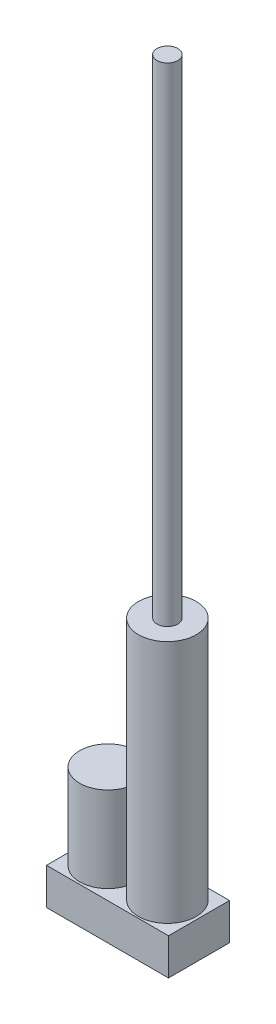
ISO-10303-21;
HEADER;
FILE_DESCRIPTION(('STEP AP214'),'2;1');
FILE_NAME('part.step','',(''),(''),'','','');
FILE_SCHEMA(('AUTOMOTIVE_DESIGN { 1 0 10303 214 1 1 1 1 }'));
ENDSEC;
DATA;
#1=APPLICATION_CONTEXT('core data for automotive mechanical design processes');
#2=APPLICATION_PROTOCOL_DEFINITION('international standard','automotive_design',2000,#1);
#3=PRODUCT_CONTEXT('',#1,'mechanical');
#4=PRODUCT('Part','Part','',(#3));
#5=PRODUCT_RELATED_PRODUCT_CATEGORY('part','',(#4));
#6=PRODUCT_DEFINITION_FORMATION('','',#4);
#7=PRODUCT_DEFINITION_CONTEXT('part definition',#1,'design');
#8=PRODUCT_DEFINITION('design','',#6,#7);
#9=PRODUCT_DEFINITION_SHAPE('','',#8);
#10=(LENGTH_UNIT() NAMED_UNIT(*) SI_UNIT(.MILLI.,.METRE.));
#11=(NAMED_UNIT(*) PLANE_ANGLE_UNIT() SI_UNIT($,.RADIAN.));
#12=(NAMED_UNIT(*) SI_UNIT($,.STERADIAN.) SOLID_ANGLE_UNIT());
#13=UNCERTAINTY_MEASURE_WITH_UNIT(LENGTH_MEASURE(1.E-05),#10,'distance_accuracy_value','');
#14=(GEOMETRIC_REPRESENTATION_CONTEXT(3) GLOBAL_UNCERTAINTY_ASSIGNED_CONTEXT((#13)) GLOBAL_UNIT_ASSIGNED_CONTEXT((#10,
#11,#12)) REPRESENTATION_CONTEXT('',''));
#15=CARTESIAN_POINT('',(0.,0.,0.));
#16=DIRECTION('',(0.,0.,1.));
#17=DIRECTION('',(1.,0.,0.));
#18=AXIS2_PLACEMENT_3D('',#15,#16,#17);
#19=CARTESIAN_POINT('',(-50.,30.,-25.));
#20=DIRECTION('',(0.,0.,-1.));
#21=DIRECTION('',(-1.,0.,0.));
#22=AXIS2_PLACEMENT_3D('',#19,#20,#21);
#23=PLANE('',#22);
#24=DIRECTION('',(1.,0.,0.));
#25=VECTOR('',#24,1.);
#26=CARTESIAN_POINT('',(-50.,0.,-25.));
#27=LINE('',#26,#25);
#28=CARTESIAN_POINT('',(-50.,0.,-25.));
#29=VERTEX_POINT('',#28);
#30=CARTESIAN_POINT('',(50.,0.,-25.));
#31=VERTEX_POINT('',#30);
#32=EDGE_CURVE('E103',#29,#31,#27,.T.);
#33=ORIENTED_EDGE('',*,*,#32,.F.);
#34=DIRECTION('',(0.,-1.,0.));
#35=VECTOR('',#34,1.);
#36=CARTESIAN_POINT('',(-50.,30.,-25.));
#37=LINE('',#36,#35);
#38=CARTESIAN_POINT('',(-50.,30.,-25.));
#39=VERTEX_POINT('',#38);
#40=EDGE_CURVE('E45',#39,#29,#37,.T.);
#41=ORIENTED_EDGE('',*,*,#40,.F.);
#42=DIRECTION('',(1.,0.,0.));
#43=VECTOR('',#42,1.);
#44=CARTESIAN_POINT('',(-50.,30.,-25.));
#45=LINE('',#44,#43);
#46=CARTESIAN_POINT('',(50.,30.,-25.));
#47=VERTEX_POINT('',#46);
#48=EDGE_CURVE('E96',#39,#47,#45,.T.);
#49=ORIENTED_EDGE('',*,*,#48,.T.);
#50=DIRECTION('',(0.,-1.,0.));
#51=VECTOR('',#50,1.);
#52=CARTESIAN_POINT('',(50.,30.,-25.));
#53=LINE('',#52,#51);
#54=EDGE_CURVE('E39',#47,#31,#53,.T.);
#55=ORIENTED_EDGE('',*,*,#54,.T.);
#56=EDGE_LOOP('',(#33,#41,#49,#55));
#57=FACE_BOUND('',#56,.T.);
#58=ADVANCED_FACE('F36',(#57),#23,.T.);
#59=CARTESIAN_POINT('',(-50.,30.,25.));
#60=DIRECTION('',(-1.,0.,0.));
#61=DIRECTION('',(0.,0.,1.));
#62=AXIS2_PLACEMENT_3D('',#59,#60,#61);
#63=PLANE('',#62);
#64=DIRECTION('',(0.,0.,-1.));
#65=VECTOR('',#64,1.);
#66=CARTESIAN_POINT('',(-50.,0.,25.));
#67=LINE('',#66,#65);
#68=CARTESIAN_POINT('',(-50.,0.,25.));
#69=VERTEX_POINT('',#68);
#70=EDGE_CURVE('E98',#69,#29,#67,.T.);
#71=ORIENTED_EDGE('',*,*,#70,.F.);
#72=DIRECTION('',(0.,-1.,0.));
#73=VECTOR('',#72,1.);
#74=CARTESIAN_POINT('',(-50.,30.,25.));
#75=LINE('',#74,#73);
#76=CARTESIAN_POINT('',(-50.,30.,25.));
#77=VERTEX_POINT('',#76);
#78=EDGE_CURVE('E69',#77,#69,#75,.T.);
#79=ORIENTED_EDGE('',*,*,#78,.F.);
#80=DIRECTION('',(0.,0.,-1.));
#81=VECTOR('',#80,1.);
#82=CARTESIAN_POINT('',(-50.,30.,25.));
#83=LINE('',#82,#81);
#84=EDGE_CURVE('E86',#77,#39,#83,.T.);
#85=ORIENTED_EDGE('',*,*,#84,.T.);
#86=ORIENTED_EDGE('',*,*,#40,.T.);
#87=EDGE_LOOP('',(#71,#79,#85,#86));
#88=FACE_BOUND('',#87,.T.);
#89=ADVANCED_FACE('F115',(#88),#63,.T.);
#90=CARTESIAN_POINT('',(-50.,30.,25.));
#91=DIRECTION('',(0.,0.,-1.));
#92=DIRECTION('',(-1.,0.,0.));
#93=AXIS2_PLACEMENT_3D('',#90,#91,#92);
#94=PLANE('',#93);
#95=DIRECTION('',(1.,0.,0.));
#96=VECTOR('',#95,1.);
#97=CARTESIAN_POINT('',(-50.,0.,25.));
#98=LINE('',#97,#96);
#99=CARTESIAN_POINT('',(50.,0.,25.));
#100=VERTEX_POINT('',#99);
#101=EDGE_CURVE('E91',#69,#100,#98,.T.);
#102=ORIENTED_EDGE('',*,*,#101,.T.);
#103=DIRECTION('',(0.,-1.,0.));
#104=VECTOR('',#103,1.);
#105=CARTESIAN_POINT('',(50.,30.,25.));
#106=LINE('',#105,#104);
#107=CARTESIAN_POINT('',(50.,30.,25.));
#108=VERTEX_POINT('',#107);
#109=EDGE_CURVE('E89',#108,#100,#106,.T.);
#110=ORIENTED_EDGE('',*,*,#109,.F.);
#111=DIRECTION('',(1.,0.,0.));
#112=VECTOR('',#111,1.);
#113=CARTESIAN_POINT('',(-50.,30.,25.));
#114=LINE('',#113,#112);
#115=EDGE_CURVE('E83',#77,#108,#114,.T.);
#116=ORIENTED_EDGE('',*,*,#115,.F.);
#117=ORIENTED_EDGE('',*,*,#78,.T.);
#118=EDGE_LOOP('',(#102,#110,#116,#117));
#119=FACE_BOUND('',#118,.T.);
#120=ADVANCED_FACE('F90',(#119),#94,.F.);
#121=CARTESIAN_POINT('',(50.,30.,25.));
#122=DIRECTION('',(-1.,0.,0.));
#123=DIRECTION('',(0.,0.,1.));
#124=AXIS2_PLACEMENT_3D('',#121,#122,#123);
#125=PLANE('',#124);
#126=DIRECTION('',(0.,0.,-1.));
#127=VECTOR('',#126,1.);
#128=CARTESIAN_POINT('',(50.,0.,25.));
#129=LINE('',#128,#127);
#130=EDGE_CURVE('E106',#100,#31,#129,.T.);
#131=ORIENTED_EDGE('',*,*,#130,.T.);
#132=ORIENTED_EDGE('',*,*,#54,.F.);
#133=DIRECTION('',(0.,0.,-1.));
#134=VECTOR('',#133,1.);
#135=CARTESIAN_POINT('',(50.,30.,25.));
#136=LINE('',#135,#134);
#137=EDGE_CURVE('E80',#108,#47,#136,.T.);
#138=ORIENTED_EDGE('',*,*,#137,.F.);
#139=ORIENTED_EDGE('',*,*,#109,.T.);
#140=EDGE_LOOP('',(#131,#132,#138,#139));
#141=FACE_BOUND('',#140,.T.);
#142=ADVANCED_FACE('F95',(#141),#125,.F.);
#143=CARTESIAN_POINT('',(0.,30.,0.));
#144=DIRECTION('',(0.,1.,0.));
#145=DIRECTION('',(0.,0.,1.));
#146=AXIS2_PLACEMENT_3D('',#143,#144,#145);
#147=PLANE('',#146);
#148=CARTESIAN_POINT('',(24.0895230885582,30.,0.));
#149=DIRECTION('',(0.,1.,0.));
#150=DIRECTION('',(0.,0.,1.));
#151=AXIS2_PLACEMENT_3D('',#148,#149,#150);
#152=CIRCLE('',#151,23.6563203313673);
#153=CARTESIAN_POINT('',(24.0895230885582,30.,23.6563203313673));
#154=VERTEX_POINT('',#153);
#155=EDGE_CURVE('E164',#154,#154,#152,.T.);
#156=ORIENTED_EDGE('',*,*,#155,.F.);
#157=EDGE_LOOP('',(#156));
#158=FACE_BOUND('',#157,.T.);
#159=CARTESIAN_POINT('',(-24.6288407696454,30.,0.));
#160=DIRECTION('',(0.,1.,0.));
#161=DIRECTION('',(0.,0.,1.));
#162=AXIS2_PLACEMENT_3D('',#159,#160,#161);
#163=CIRCLE('',#162,23.1627718029796);
#164=CARTESIAN_POINT('',(-24.6288407696454,30.,23.1627718029796));
#165=VERTEX_POINT('',#164);
#166=EDGE_CURVE('E171',#165,#165,#163,.T.);
#167=ORIENTED_EDGE('',*,*,#166,.F.);
#168=EDGE_LOOP('',(#167));
#169=FACE_BOUND('',#168,.T.);
#170=ORIENTED_EDGE('',*,*,#48,.F.);
#171=ORIENTED_EDGE('',*,*,#84,.F.);
#172=ORIENTED_EDGE('',*,*,#115,.T.);
#173=ORIENTED_EDGE('',*,*,#137,.T.);
#174=EDGE_LOOP('',(#170,#171,#172,#173));
#175=FACE_BOUND('',#174,.T.);
#176=ADVANCED_FACE('F85',(#158,#169,#175),#147,.T.);
#177=CARTESIAN_POINT('',(0.,0.,0.));
#178=DIRECTION('',(0.,1.,0.));
#179=DIRECTION('',(0.,0.,1.));
#180=AXIS2_PLACEMENT_3D('',#177,#178,#179);
#181=PLANE('',#180);
#182=ORIENTED_EDGE('',*,*,#32,.T.);
#183=ORIENTED_EDGE('',*,*,#130,.F.);
#184=ORIENTED_EDGE('',*,*,#101,.F.);
#185=ORIENTED_EDGE('',*,*,#70,.T.);
#186=EDGE_LOOP('',(#182,#183,#184,#185));
#187=FACE_BOUND('',#186,.T.);
#188=ADVANCED_FACE('F114',(#187),#181,.F.);
#189=CARTESIAN_POINT('',(-24.6288407696454,100.,0.));
#190=DIRECTION('',(0.,-1.,0.));
#191=DIRECTION('',(0.,0.,-1.));
#192=AXIS2_PLACEMENT_3D('',#189,#190,#191);
#193=CYLINDRICAL_SURFACE('',#192,23.1627718029796);
#194=CARTESIAN_POINT('',(-24.6288407696454,100.,0.));
#195=DIRECTION('',(0.,1.,0.));
#196=DIRECTION('',(0.,0.,1.));
#197=AXIS2_PLACEMENT_3D('',#194,#195,#196);
#198=CIRCLE('',#197,23.1627718029796);
#199=CARTESIAN_POINT('',(-24.6288407696454,100.,23.1627718029796));
#200=VERTEX_POINT('',#199);
#201=EDGE_CURVE('E107',#200,#200,#198,.T.);
#202=ORIENTED_EDGE('',*,*,#201,.F.);
#203=EDGE_LOOP('',(#202));
#204=FACE_BOUND('',#203,.T.);
#205=ORIENTED_EDGE('',*,*,#166,.T.);
#206=EDGE_LOOP('',(#205));
#207=FACE_BOUND('',#206,.T.);
#208=ADVANCED_FACE('F133',(#204,#207),#193,.T.);
#209=CARTESIAN_POINT('',(-24.6288407696454,100.,0.));
#210=DIRECTION('',(0.,1.,0.));
#211=DIRECTION('',(0.,0.,1.));
#212=AXIS2_PLACEMENT_3D('',#209,#210,#211);
#213=PLANE('',#212);
#214=ORIENTED_EDGE('',*,*,#201,.T.);
#215=EDGE_LOOP('',(#214));
#216=FACE_BOUND('',#215,.T.);
#217=ADVANCED_FACE('F139',(#216),#213,.T.);
#218=CARTESIAN_POINT('',(24.0895230885582,230.,0.));
#219=DIRECTION('',(0.,-1.,0.));
#220=DIRECTION('',(0.,0.,-1.));
#221=AXIS2_PLACEMENT_3D('',#218,#219,#220);
#222=CYLINDRICAL_SURFACE('',#221,23.6563203313673);
#223=CARTESIAN_POINT('',(24.0895230885582,230.,0.));
#224=DIRECTION('',(0.,1.,0.));
#225=DIRECTION('',(0.,0.,1.));
#226=AXIS2_PLACEMENT_3D('',#223,#224,#225);
#227=CIRCLE('',#226,23.6563203313673);
#228=CARTESIAN_POINT('',(24.0895230885582,230.,23.6563203313673));
#229=VERTEX_POINT('',#228);
#230=EDGE_CURVE('E167',#229,#229,#227,.T.);
#231=ORIENTED_EDGE('',*,*,#230,.F.);
#232=EDGE_LOOP('',(#231));
#233=FACE_BOUND('',#232,.T.);
#234=ORIENTED_EDGE('',*,*,#155,.T.);
#235=EDGE_LOOP('',(#234));
#236=FACE_BOUND('',#235,.T.);
#237=ADVANCED_FACE('F143',(#233,#236),#222,.T.);
#238=CARTESIAN_POINT('',(24.0895230885582,230.,0.));
#239=DIRECTION('',(0.,1.,0.));
#240=DIRECTION('',(0.,0.,1.));
#241=AXIS2_PLACEMENT_3D('',#238,#239,#240);
#242=PLANE('',#241);
#243=CARTESIAN_POINT('',(24.0895230885582,230.,0.));
#244=DIRECTION('',(0.,1.,0.));
#245=DIRECTION('',(0.,0.,1.));
#246=AXIS2_PLACEMENT_3D('',#243,#244,#245);
#247=CIRCLE('',#246,8.52546609340794);
#248=CARTESIAN_POINT('',(24.0895230885582,230.,8.52546609340794));
#249=VERTEX_POINT('',#248);
#250=EDGE_CURVE('E11',#249,#249,#247,.T.);
#251=ORIENTED_EDGE('',*,*,#250,.F.);
#252=EDGE_LOOP('',(#251));
#253=FACE_BOUND('',#252,.T.);
#254=ORIENTED_EDGE('',*,*,#230,.T.);
#255=EDGE_LOOP('',(#254));
#256=FACE_BOUND('',#255,.T.);
#257=ADVANCED_FACE('F147',(#253,#256),#242,.T.);
#258=CARTESIAN_POINT('',(24.0895230885582,630.,0.));
#259=DIRECTION('',(0.,-1.,0.));
#260=DIRECTION('',(0.,0.,-1.));
#261=AXIS2_PLACEMENT_3D('',#258,#259,#260);
#262=CYLINDRICAL_SURFACE('',#261,8.52546609340794);
#263=CARTESIAN_POINT('',(24.0895230885582,630.,0.));
#264=DIRECTION('',(0.,1.,0.));
#265=DIRECTION('',(0.,0.,1.));
#266=AXIS2_PLACEMENT_3D('',#263,#264,#265);
#267=CIRCLE('',#266,8.52546609340794);
#268=CARTESIAN_POINT('',(24.0895230885582,630.,8.52546609340794));
#269=VERTEX_POINT('',#268);
#270=EDGE_CURVE('E163',#269,#269,#267,.T.);
#271=ORIENTED_EDGE('',*,*,#270,.F.);
#272=EDGE_LOOP('',(#271));
#273=FACE_BOUND('',#272,.T.);
#274=ORIENTED_EDGE('',*,*,#250,.T.);
#275=EDGE_LOOP('',(#274));
#276=FACE_BOUND('',#275,.T.);
#277=ADVANCED_FACE('F151',(#273,#276),#262,.T.);
#278=CARTESIAN_POINT('',(24.0895230885582,630.,0.));
#279=DIRECTION('',(0.,1.,0.));
#280=DIRECTION('',(0.,0.,1.));
#281=AXIS2_PLACEMENT_3D('',#278,#279,#280);
#282=PLANE('',#281);
#283=ORIENTED_EDGE('',*,*,#270,.T.);
#284=EDGE_LOOP('',(#283));
#285=FACE_BOUND('',#284,.T.);
#286=ADVANCED_FACE('F155',(#285),#282,.T.);
#287=CLOSED_SHELL('',(#58,#89,#120,#142,#176,#188,#208,#217,#237,#257,#277,#286));
#288=MANIFOLD_SOLID_BREP('B2',#287);
#289=ADVANCED_BREP_SHAPE_REPRESENTATION('',(#18,#288),#14);
#290=SHAPE_DEFINITION_REPRESENTATION(#9,#289);
ENDSEC;
END-ISO-10303-21;
